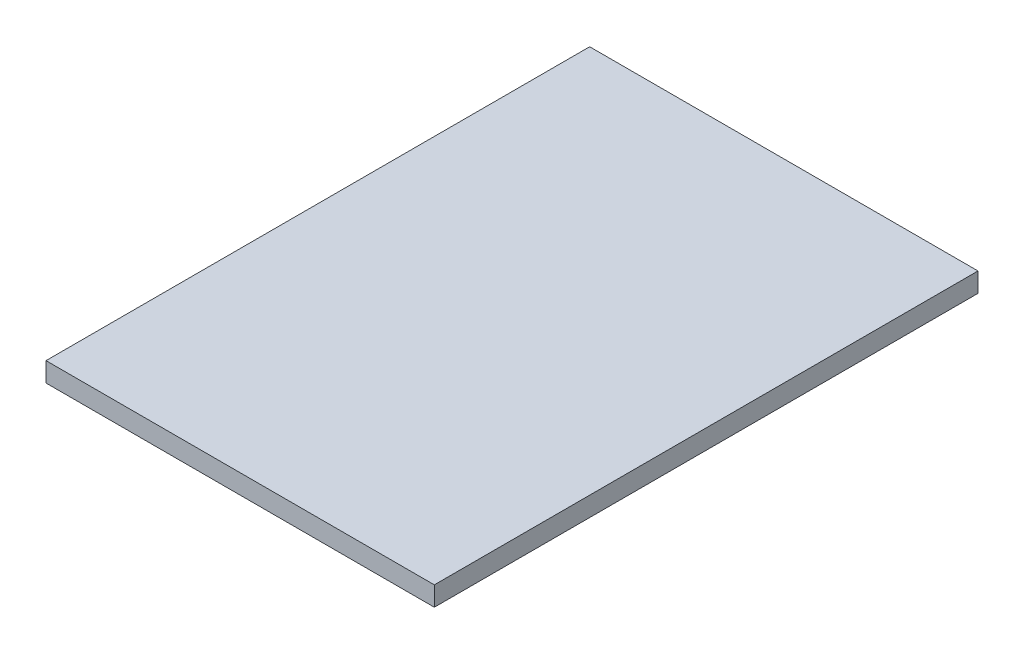
ISO-10303-21;
HEADER;
FILE_DESCRIPTION(('STEP AP214'),'2;1');
FILE_NAME('part.step','',(''),(''),'','','');
FILE_SCHEMA(('AUTOMOTIVE_DESIGN { 1 0 10303 214 1 1 1 1 }'));
ENDSEC;
DATA;
#1=APPLICATION_CONTEXT('core data for automotive mechanical design processes');
#2=APPLICATION_PROTOCOL_DEFINITION('international standard','automotive_design',2000,#1);
#3=PRODUCT_CONTEXT('',#1,'mechanical');
#4=PRODUCT('Part','Part','',(#3));
#5=PRODUCT_RELATED_PRODUCT_CATEGORY('part','',(#4));
#6=PRODUCT_DEFINITION_FORMATION('','',#4);
#7=PRODUCT_DEFINITION_CONTEXT('part definition',#1,'design');
#8=PRODUCT_DEFINITION('design','',#6,#7);
#9=PRODUCT_DEFINITION_SHAPE('','',#8);
#10=(LENGTH_UNIT() NAMED_UNIT(*) SI_UNIT(.MILLI.,.METRE.));
#11=(NAMED_UNIT(*) PLANE_ANGLE_UNIT() SI_UNIT($,.RADIAN.));
#12=(NAMED_UNIT(*) SI_UNIT($,.STERADIAN.) SOLID_ANGLE_UNIT());
#13=UNCERTAINTY_MEASURE_WITH_UNIT(LENGTH_MEASURE(1.E-05),#10,'distance_accuracy_value','');
#14=(GEOMETRIC_REPRESENTATION_CONTEXT(3) GLOBAL_UNCERTAINTY_ASSIGNED_CONTEXT((#13)) GLOBAL_UNIT_ASSIGNED_CONTEXT((#10,
#11,#12)) REPRESENTATION_CONTEXT('',''));
#15=CARTESIAN_POINT('',(0.,0.,0.));
#16=DIRECTION('',(0.,0.,1.));
#17=DIRECTION('',(1.,0.,0.));
#18=AXIS2_PLACEMENT_3D('',#15,#16,#17);
#19=CARTESIAN_POINT('',(-90.,4.5,-126.));
#20=DIRECTION('',(1.,0.,0.));
#21=DIRECTION('',(0.,0.,-1.));
#22=AXIS2_PLACEMENT_3D('',#19,#20,#21);
#23=PLANE('',#22);
#24=DIRECTION('',(0.,0.,1.));
#25=VECTOR('',#24,1.);
#26=CARTESIAN_POINT('',(-90.,-4.5,-126.));
#27=LINE('',#26,#25);
#28=CARTESIAN_POINT('',(-90.,-4.5,-126.));
#29=VERTEX_POINT('',#28);
#30=CARTESIAN_POINT('',(-90.,-4.5,126.));
#31=VERTEX_POINT('',#30);
#32=EDGE_CURVE('E98',#29,#31,#27,.T.);
#33=ORIENTED_EDGE('',*,*,#32,.T.);
#34=DIRECTION('',(0.,-1.,0.));
#35=VECTOR('',#34,1.);
#36=CARTESIAN_POINT('',(-90.,4.5,126.));
#37=LINE('',#36,#35);
#38=CARTESIAN_POINT('',(-90.,4.5,126.));
#39=VERTEX_POINT('',#38);
#40=EDGE_CURVE('E11',#39,#31,#37,.T.);
#41=ORIENTED_EDGE('',*,*,#40,.F.);
#42=DIRECTION('',(0.,0.,1.));
#43=VECTOR('',#42,1.);
#44=CARTESIAN_POINT('',(-90.,4.5,-126.));
#45=LINE('',#44,#43);
#46=CARTESIAN_POINT('',(-90.,4.5,-126.));
#47=VERTEX_POINT('',#46);
#48=EDGE_CURVE('E86',#47,#39,#45,.T.);
#49=ORIENTED_EDGE('',*,*,#48,.F.);
#50=DIRECTION('',(0.,-1.,0.));
#51=VECTOR('',#50,1.);
#52=CARTESIAN_POINT('',(-90.,4.5,-126.));
#53=LINE('',#52,#51);
#54=EDGE_CURVE('E94',#47,#29,#53,.T.);
#55=ORIENTED_EDGE('',*,*,#54,.T.);
#56=EDGE_LOOP('',(#33,#41,#49,#55));
#57=FACE_BOUND('',#56,.T.);
#58=ADVANCED_FACE('F35',(#57),#23,.F.);
#59=CARTESIAN_POINT('',(-90.,4.5,126.));
#60=DIRECTION('',(0.,0.,-1.));
#61=DIRECTION('',(-1.,0.,0.));
#62=AXIS2_PLACEMENT_3D('',#59,#60,#61);
#63=PLANE('',#62);
#64=DIRECTION('',(1.,0.,0.));
#65=VECTOR('',#64,1.);
#66=CARTESIAN_POINT('',(-90.,-4.5,126.));
#67=LINE('',#66,#65);
#68=CARTESIAN_POINT('',(90.,-4.5,126.));
#69=VERTEX_POINT('',#68);
#70=EDGE_CURVE('E90',#31,#69,#67,.T.);
#71=ORIENTED_EDGE('',*,*,#70,.T.);
#72=DIRECTION('',(0.,-1.,0.));
#73=VECTOR('',#72,1.);
#74=CARTESIAN_POINT('',(90.,4.5,126.));
#75=LINE('',#74,#73);
#76=CARTESIAN_POINT('',(90.,4.5,126.));
#77=VERTEX_POINT('',#76);
#78=EDGE_CURVE('E43',#77,#69,#75,.T.);
#79=ORIENTED_EDGE('',*,*,#78,.F.);
#80=DIRECTION('',(1.,0.,0.));
#81=VECTOR('',#80,1.);
#82=CARTESIAN_POINT('',(-90.,4.5,126.));
#83=LINE('',#82,#81);
#84=EDGE_CURVE('E81',#39,#77,#83,.T.);
#85=ORIENTED_EDGE('',*,*,#84,.F.);
#86=ORIENTED_EDGE('',*,*,#40,.T.);
#87=EDGE_LOOP('',(#71,#79,#85,#86));
#88=FACE_BOUND('',#87,.T.);
#89=ADVANCED_FACE('F89',(#88),#63,.F.);
#90=CARTESIAN_POINT('',(90.,4.5,-126.));
#91=DIRECTION('',(-1.,0.,0.));
#92=DIRECTION('',(0.,0.,1.));
#93=AXIS2_PLACEMENT_3D('',#90,#91,#92);
#94=PLANE('',#93);
#95=DIRECTION('',(0.,0.,-1.));
#96=VECTOR('',#95,1.);
#97=CARTESIAN_POINT('',(90.,-4.5,-126.));
#98=LINE('',#97,#96);
#99=CARTESIAN_POINT('',(90.,-4.5,-126.));
#100=VERTEX_POINT('',#99);
#101=EDGE_CURVE('E68',#69,#100,#98,.T.);
#102=ORIENTED_EDGE('',*,*,#101,.T.);
#103=DIRECTION('',(0.,-1.,0.));
#104=VECTOR('',#103,1.);
#105=CARTESIAN_POINT('',(90.,4.5,-126.));
#106=LINE('',#105,#104);
#107=CARTESIAN_POINT('',(90.,4.5,-126.));
#108=VERTEX_POINT('',#107);
#109=EDGE_CURVE('E91',#108,#100,#106,.T.);
#110=ORIENTED_EDGE('',*,*,#109,.F.);
#111=DIRECTION('',(0.,0.,-1.));
#112=VECTOR('',#111,1.);
#113=CARTESIAN_POINT('',(90.,4.5,-126.));
#114=LINE('',#113,#112);
#115=EDGE_CURVE('E84',#77,#108,#114,.T.);
#116=ORIENTED_EDGE('',*,*,#115,.F.);
#117=ORIENTED_EDGE('',*,*,#78,.T.);
#118=EDGE_LOOP('',(#102,#110,#116,#117));
#119=FACE_BOUND('',#118,.T.);
#120=ADVANCED_FACE('F92',(#119),#94,.F.);
#121=CARTESIAN_POINT('',(-90.,4.5,-126.));
#122=DIRECTION('',(0.,0.,1.));
#123=DIRECTION('',(1.,0.,0.));
#124=AXIS2_PLACEMENT_3D('',#121,#122,#123);
#125=PLANE('',#124);
#126=DIRECTION('',(-1.,0.,0.));
#127=VECTOR('',#126,1.);
#128=CARTESIAN_POINT('',(-90.,-4.5,-126.));
#129=LINE('',#128,#127);
#130=EDGE_CURVE('E74',#100,#29,#129,.T.);
#131=ORIENTED_EDGE('',*,*,#130,.T.);
#132=ORIENTED_EDGE('',*,*,#54,.F.);
#133=DIRECTION('',(-1.,0.,0.));
#134=VECTOR('',#133,1.);
#135=CARTESIAN_POINT('',(-90.,4.5,-126.));
#136=LINE('',#135,#134);
#137=EDGE_CURVE('E51',#108,#47,#136,.T.);
#138=ORIENTED_EDGE('',*,*,#137,.F.);
#139=ORIENTED_EDGE('',*,*,#109,.T.);
#140=EDGE_LOOP('',(#131,#132,#138,#139));
#141=FACE_BOUND('',#140,.T.);
#142=ADVANCED_FACE('F105',(#141),#125,.F.);
#143=CARTESIAN_POINT('',(0.,4.5,0.));
#144=DIRECTION('',(0.,1.,0.));
#145=DIRECTION('',(0.,0.,1.));
#146=AXIS2_PLACEMENT_3D('',#143,#144,#145);
#147=PLANE('',#146);
#148=ORIENTED_EDGE('',*,*,#48,.T.);
#149=ORIENTED_EDGE('',*,*,#84,.T.);
#150=ORIENTED_EDGE('',*,*,#115,.T.);
#151=ORIENTED_EDGE('',*,*,#137,.T.);
#152=EDGE_LOOP('',(#148,#149,#150,#151));
#153=FACE_BOUND('',#152,.T.);
#154=ADVANCED_FACE('F82',(#153),#147,.T.);
#155=CARTESIAN_POINT('',(0.,-4.5,0.));
#156=DIRECTION('',(0.,1.,0.));
#157=DIRECTION('',(0.,0.,1.));
#158=AXIS2_PLACEMENT_3D('',#155,#156,#157);
#159=PLANE('',#158);
#160=ORIENTED_EDGE('',*,*,#32,.F.);
#161=ORIENTED_EDGE('',*,*,#130,.F.);
#162=ORIENTED_EDGE('',*,*,#101,.F.);
#163=ORIENTED_EDGE('',*,*,#70,.F.);
#164=EDGE_LOOP('',(#160,#161,#162,#163));
#165=FACE_BOUND('',#164,.T.);
#166=ADVANCED_FACE('F108',(#165),#159,.F.);
#167=CLOSED_SHELL('',(#58,#89,#120,#142,#154,#166));
#168=MANIFOLD_SOLID_BREP('B2',#167);
#169=ADVANCED_BREP_SHAPE_REPRESENTATION('',(#18,#168),#14);
#170=SHAPE_DEFINITION_REPRESENTATION(#9,#169);
ENDSEC;
END-ISO-10303-21;
